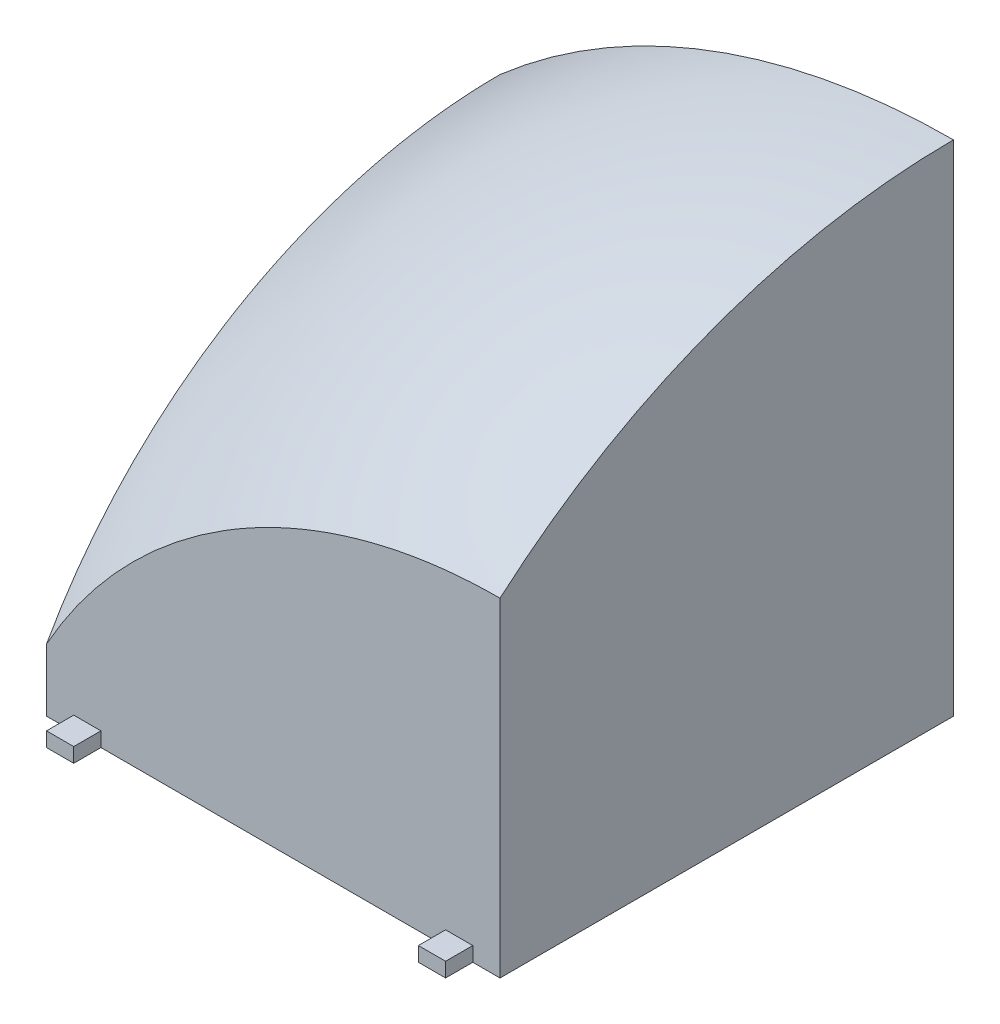
ISO-10303-21;
HEADER;
FILE_DESCRIPTION(('STEP AP214'),'2;1');
FILE_NAME('part.step','',(''),(''),'','','');
FILE_SCHEMA(('AUTOMOTIVE_DESIGN { 1 0 10303 214 1 1 1 1 }'));
ENDSEC;
DATA;
#1=APPLICATION_CONTEXT('core data for automotive mechanical design processes');
#2=APPLICATION_PROTOCOL_DEFINITION('international standard','automotive_design',2000,#1);
#3=PRODUCT_CONTEXT('',#1,'mechanical');
#4=PRODUCT('Part','Part','',(#3));
#5=PRODUCT_RELATED_PRODUCT_CATEGORY('part','',(#4));
#6=PRODUCT_DEFINITION_FORMATION('','',#4);
#7=PRODUCT_DEFINITION_CONTEXT('part definition',#1,'design');
#8=PRODUCT_DEFINITION('design','',#6,#7);
#9=PRODUCT_DEFINITION_SHAPE('','',#8);
#10=(LENGTH_UNIT() NAMED_UNIT(*) SI_UNIT(.MILLI.,.METRE.));
#11=(NAMED_UNIT(*) PLANE_ANGLE_UNIT() SI_UNIT($,.RADIAN.));
#12=(NAMED_UNIT(*) SI_UNIT($,.STERADIAN.) SOLID_ANGLE_UNIT());
#13=UNCERTAINTY_MEASURE_WITH_UNIT(LENGTH_MEASURE(1.E-05),#10,'distance_accuracy_value','');
#14=(GEOMETRIC_REPRESENTATION_CONTEXT(3) GLOBAL_UNCERTAINTY_ASSIGNED_CONTEXT((#13)) GLOBAL_UNIT_ASSIGNED_CONTEXT((#10,
#11,#12)) REPRESENTATION_CONTEXT('',''));
#15=CARTESIAN_POINT('',(0.,0.,0.));
#16=DIRECTION('',(0.,0.,1.));
#17=DIRECTION('',(1.,0.,0.));
#18=AXIS2_PLACEMENT_3D('',#15,#16,#17);
#19=CARTESIAN_POINT('',(-317.5,508.,0.));
#20=DIRECTION('',(1.,0.,0.));
#21=DIRECTION('',(0.,0.,-1.));
#22=AXIS2_PLACEMENT_3D('',#19,#20,#21);
#23=PLANE('',#22);
#24=DIRECTION('',(0.,0.,1.));
#25=VECTOR('',#24,1.);
#26=CARTESIAN_POINT('',(-317.5,143.307853797554,298.45));
#27=LINE('',#26,#25);
#28=CARTESIAN_POINT('',(-317.5,143.307853797554,279.4));
#29=VERTEX_POINT('',#28);
#30=CARTESIAN_POINT('',(-317.5,143.307853797554,298.45));
#31=VERTEX_POINT('',#30);
#32=EDGE_CURVE('E267',#29,#31,#27,.T.);
#33=ORIENTED_EDGE('',*,*,#32,.T.);
#34=DIRECTION('',(0.,-1.,0.));
#35=VECTOR('',#34,1.);
#36=CARTESIAN_POINT('',(-317.5,143.307853797554,298.45));
#37=LINE('',#36,#35);
#38=CARTESIAN_POINT('',(-317.5,133.147853797553,298.45));
#39=VERTEX_POINT('',#38);
#40=EDGE_CURVE('E277',#31,#39,#37,.T.);
#41=ORIENTED_EDGE('',*,*,#40,.T.);
#42=DIRECTION('',(0.,0.,-1.));
#43=VECTOR('',#42,1.);
#44=CARTESIAN_POINT('',(-317.5,133.147853797553,354.313014613424));
#45=LINE('',#44,#43);
#46=CARTESIAN_POINT('',(-317.5,133.147853797553,317.5));
#47=VERTEX_POINT('',#46);
#48=EDGE_CURVE('E408',#47,#39,#45,.T.);
#49=ORIENTED_EDGE('',*,*,#48,.F.);
#50=DIRECTION('',(0.,-1.,0.));
#51=VECTOR('',#50,1.);
#52=CARTESIAN_POINT('',(-317.5,508.,317.5));
#53=LINE('',#52,#51);
#54=CARTESIAN_POINT('',(-317.5,176.890531120238,317.5));
#55=VERTEX_POINT('',#54);
#56=EDGE_CURVE('E421',#55,#47,#53,.T.);
#57=ORIENTED_EDGE('',*,*,#56,.F.);
#58=CARTESIAN_POINT('',(-317.5,0.,0.));
#59=DIRECTION('',(1.,0.,0.));
#60=DIRECTION('',(0.,0.,-1.));
#61=AXIS2_PLACEMENT_3D('',#58,#59,#60);
#62=CIRCLE('',#61,363.450835739856);
#63=CARTESIAN_POINT('',(-317.5,363.450835739856,0.));
#64=VERTEX_POINT('',#63);
#65=EDGE_CURVE('E432',#55,#64,#62,.F.);
#66=ORIENTED_EDGE('',*,*,#65,.T.);
#67=DIRECTION('',(0.,-1.,0.));
#68=VECTOR('',#67,1.);
#69=CARTESIAN_POINT('',(-317.5,508.,0.));
#70=LINE('',#69,#68);
#71=CARTESIAN_POINT('',(-317.5,133.147853797553,0.));
#72=VERTEX_POINT('',#71);
#73=EDGE_CURVE('E424',#64,#72,#70,.T.);
#74=ORIENTED_EDGE('',*,*,#73,.T.);
#75=CARTESIAN_POINT('',(-317.5,133.147853797553,19.0500000000001));
#76=VERTEX_POINT('',#75);
#77=EDGE_CURVE('E403',#76,#72,#45,.T.);
#78=ORIENTED_EDGE('',*,*,#77,.F.);
#79=DIRECTION('',(0.,-1.,0.));
#80=VECTOR('',#79,1.);
#81=CARTESIAN_POINT('',(-317.5,143.307853797554,19.0500000000001));
#82=LINE('',#81,#80);
#83=CARTESIAN_POINT('',(-317.5,143.307853797554,19.0500000000001));
#84=VERTEX_POINT('',#83);
#85=EDGE_CURVE('E299',#84,#76,#82,.T.);
#86=ORIENTED_EDGE('',*,*,#85,.F.);
#87=DIRECTION('',(0.,0.,1.));
#88=VECTOR('',#87,1.);
#89=CARTESIAN_POINT('',(-317.5,143.307853797554,19.0500000000001));
#90=LINE('',#89,#88);
#91=CARTESIAN_POINT('',(-317.5,143.307853797554,38.1000000000001));
#92=VERTEX_POINT('',#91);
#93=EDGE_CURVE('E289',#84,#92,#90,.T.);
#94=ORIENTED_EDGE('',*,*,#93,.T.);
#95=DIRECTION('',(0.,-1.,0.));
#96=VECTOR('',#95,1.);
#97=CARTESIAN_POINT('',(-317.5,143.307853797554,38.1000000000001));
#98=LINE('',#97,#96);
#99=CARTESIAN_POINT('',(-317.5,133.147853797553,38.1000000000001));
#100=VERTEX_POINT('',#99);
#101=EDGE_CURVE('E312',#92,#100,#98,.T.);
#102=ORIENTED_EDGE('',*,*,#101,.T.);
#103=CARTESIAN_POINT('',(-317.5,133.147853797553,279.4));
#104=VERTEX_POINT('',#103);
#105=EDGE_CURVE('E412',#104,#100,#45,.T.);
#106=ORIENTED_EDGE('',*,*,#105,.F.);
#107=DIRECTION('',(0.,-1.,0.));
#108=VECTOR('',#107,1.);
#109=CARTESIAN_POINT('',(-317.5,143.307853797554,279.4));
#110=LINE('',#109,#108);
#111=EDGE_CURVE('E281',#29,#104,#110,.T.);
#112=ORIENTED_EDGE('',*,*,#111,.F.);
#113=EDGE_LOOP('',(#33,#41,#49,#57,#66,#74,#78,#86,#94,#102,#106,#112));
#114=FACE_BOUND('',#113,.T.);
#115=ADVANCED_FACE('F40',(#114),#23,.F.);
#116=CARTESIAN_POINT('',(0.,508.,317.5));
#117=DIRECTION('',(0.,0.,-1.));
#118=DIRECTION('',(-1.,0.,0.));
#119=AXIS2_PLACEMENT_3D('',#116,#117,#118);
#120=PLANE('',#119);
#121=DIRECTION('',(1.,0.,0.));
#122=VECTOR('',#121,1.);
#123=CARTESIAN_POINT('',(-19.0499999999999,143.307853797554,317.5));
#124=LINE('',#123,#122);
#125=CARTESIAN_POINT('',(-38.1,143.307853797554,317.5));
#126=VERTEX_POINT('',#125);
#127=CARTESIAN_POINT('',(-19.0499999999999,143.307853797554,317.5));
#128=VERTEX_POINT('',#127);
#129=EDGE_CURVE('E326',#126,#128,#124,.T.);
#130=ORIENTED_EDGE('',*,*,#129,.T.);
#131=DIRECTION('',(0.,-1.,0.));
#132=VECTOR('',#131,1.);
#133=CARTESIAN_POINT('',(-19.0499999999999,143.307853797554,317.5));
#134=LINE('',#133,#132);
#135=CARTESIAN_POINT('',(-19.0499999999999,133.147853797553,317.5));
#136=VERTEX_POINT('',#135);
#137=EDGE_CURVE('E336',#128,#136,#134,.T.);
#138=ORIENTED_EDGE('',*,*,#137,.T.);
#139=DIRECTION('',(1.,0.,0.));
#140=VECTOR('',#139,1.);
#141=CARTESIAN_POINT('',(0.,133.147853797553,317.5));
#142=LINE('',#141,#140);
#143=CARTESIAN_POINT('',(0.,133.147853797553,317.5));
#144=VERTEX_POINT('',#143);
#145=EDGE_CURVE('E49',#136,#144,#142,.T.);
#146=ORIENTED_EDGE('',*,*,#145,.T.);
#147=DIRECTION('',(0.,-1.,0.));
#148=VECTOR('',#147,1.);
#149=CARTESIAN_POINT('',(0.,508.,317.5));
#150=LINE('',#149,#148);
#151=CARTESIAN_POINT('',(0.,363.450835739856,317.5));
#152=VERTEX_POINT('',#151);
#153=EDGE_CURVE('E418',#152,#144,#150,.T.);
#154=ORIENTED_EDGE('',*,*,#153,.F.);
#155=CARTESIAN_POINT('',(0.,0.,317.5));
#156=DIRECTION('',(0.,0.,-1.));
#157=DIRECTION('',(-1.,0.,0.));
#158=AXIS2_PLACEMENT_3D('',#155,#156,#157);
#159=CIRCLE('',#158,363.450835739856);
#160=EDGE_CURVE('E430',#152,#55,#159,.F.);
#161=ORIENTED_EDGE('',*,*,#160,.T.);
#162=ORIENTED_EDGE('',*,*,#56,.T.);
#163=CARTESIAN_POINT('',(-298.45,133.147853797553,317.5));
#164=VERTEX_POINT('',#163);
#165=EDGE_CURVE('E11',#47,#164,#142,.T.);
#166=ORIENTED_EDGE('',*,*,#165,.T.);
#167=DIRECTION('',(0.,-1.,0.));
#168=VECTOR('',#167,1.);
#169=CARTESIAN_POINT('',(-298.45,143.307853797554,317.5));
#170=LINE('',#169,#168);
#171=CARTESIAN_POINT('',(-298.45,143.307853797554,317.5));
#172=VERTEX_POINT('',#171);
#173=EDGE_CURVE('E359',#172,#164,#170,.T.);
#174=ORIENTED_EDGE('',*,*,#173,.F.);
#175=DIRECTION('',(1.,0.,0.));
#176=VECTOR('',#175,1.);
#177=CARTESIAN_POINT('',(-298.45,143.307853797554,317.5));
#178=LINE('',#177,#176);
#179=CARTESIAN_POINT('',(-279.4,143.307853797554,317.5));
#180=VERTEX_POINT('',#179);
#181=EDGE_CURVE('E349',#172,#180,#178,.T.);
#182=ORIENTED_EDGE('',*,*,#181,.T.);
#183=DIRECTION('',(0.,-1.,0.));
#184=VECTOR('',#183,1.);
#185=CARTESIAN_POINT('',(-279.4,143.307853797554,317.5));
#186=LINE('',#185,#184);
#187=CARTESIAN_POINT('',(-279.4,133.147853797553,317.5));
#188=VERTEX_POINT('',#187);
#189=EDGE_CURVE('E372',#180,#188,#186,.T.);
#190=ORIENTED_EDGE('',*,*,#189,.T.);
#191=CARTESIAN_POINT('',(-38.1,133.147853797553,317.5));
#192=VERTEX_POINT('',#191);
#193=EDGE_CURVE('E48',#188,#192,#142,.T.);
#194=ORIENTED_EDGE('',*,*,#193,.T.);
#195=DIRECTION('',(0.,-1.,0.));
#196=VECTOR('',#195,1.);
#197=CARTESIAN_POINT('',(-38.0999999999999,143.307853797554,317.5));
#198=LINE('',#197,#196);
#199=EDGE_CURVE('E340',#126,#192,#198,.T.);
#200=ORIENTED_EDGE('',*,*,#199,.F.);
#201=EDGE_LOOP('',(#130,#138,#146,#154,#161,#162,#166,#174,#182,#190,#194,#200));
#202=FACE_BOUND('',#201,.T.);
#203=ADVANCED_FACE('F444',(#202),#120,.F.);
#204=CARTESIAN_POINT('',(0.,508.,0.));
#205=DIRECTION('',(-1.,0.,0.));
#206=DIRECTION('',(0.,0.,1.));
#207=AXIS2_PLACEMENT_3D('',#204,#205,#206);
#208=PLANE('',#207);
#209=ORIENTED_EDGE('',*,*,#153,.T.);
#210=DIRECTION('',(0.,0.,-1.));
#211=VECTOR('',#210,1.);
#212=CARTESIAN_POINT('',(0.,133.147853797553,0.));
#213=LINE('',#212,#211);
#214=CARTESIAN_POINT('',(0.,133.147853797553,0.));
#215=VERTEX_POINT('',#214);
#216=EDGE_CURVE('E411',#144,#215,#213,.T.);
#217=ORIENTED_EDGE('',*,*,#216,.T.);
#218=DIRECTION('',(0.,-1.,0.));
#219=VECTOR('',#218,1.);
#220=CARTESIAN_POINT('',(0.,508.,0.));
#221=LINE('',#220,#219);
#222=CARTESIAN_POINT('',(0.,482.6,0.));
#223=VERTEX_POINT('',#222);
#224=EDGE_CURVE('E427',#223,#215,#221,.T.);
#225=ORIENTED_EDGE('',*,*,#224,.F.);
#226=CARTESIAN_POINT('',(0.,0.,0.));
#227=DIRECTION('',(-1.,0.,0.));
#228=DIRECTION('',(0.,0.,1.));
#229=AXIS2_PLACEMENT_3D('',#226,#227,#228);
#230=CIRCLE('',#229,482.6);
#231=EDGE_CURVE('E435',#223,#152,#230,.F.);
#232=ORIENTED_EDGE('',*,*,#231,.T.);
#233=EDGE_LOOP('',(#209,#217,#225,#232));
#234=FACE_BOUND('',#233,.T.);
#235=ADVANCED_FACE('F481',(#234),#208,.F.);
#236=CARTESIAN_POINT('',(0.,508.,0.));
#237=DIRECTION('',(0.,0.,1.));
#238=DIRECTION('',(1.,0.,0.));
#239=AXIS2_PLACEMENT_3D('',#236,#237,#238);
#240=PLANE('',#239);
#241=ORIENTED_EDGE('',*,*,#224,.T.);
#242=DIRECTION('',(-1.,0.,0.));
#243=VECTOR('',#242,1.);
#244=CARTESIAN_POINT('',(0.,133.147853797553,0.));
#245=LINE('',#244,#243);
#246=EDGE_CURVE('E415',#215,#72,#245,.T.);
#247=ORIENTED_EDGE('',*,*,#246,.T.);
#248=ORIENTED_EDGE('',*,*,#73,.F.);
#249=CARTESIAN_POINT('',(0.,0.,0.));
#250=DIRECTION('',(0.,0.,1.));
#251=DIRECTION('',(1.,0.,0.));
#252=AXIS2_PLACEMENT_3D('',#249,#250,#251);
#253=CIRCLE('',#252,482.6);
#254=EDGE_CURVE('E434',#64,#223,#253,.F.);
#255=ORIENTED_EDGE('',*,*,#254,.T.);
#256=EDGE_LOOP('',(#241,#247,#248,#255));
#257=FACE_BOUND('',#256,.T.);
#258=ADVANCED_FACE('F485',(#257),#240,.F.);
#259=CARTESIAN_POINT('',(0.,0.,0.));
#260=DIRECTION('',(0.,1.,0.));
#261=DIRECTION('',(1.,0.,0.));
#262=AXIS2_PLACEMENT_3D('',#259,#260,#261);
#263=SPHERICAL_SURFACE('',#262,482.6);
#264=ORIENTED_EDGE('',*,*,#231,.F.);
#265=ORIENTED_EDGE('',*,*,#254,.F.);
#266=ORIENTED_EDGE('',*,*,#65,.F.);
#267=ORIENTED_EDGE('',*,*,#160,.F.);
#268=EDGE_LOOP('',(#264,#265,#266,#267));
#269=FACE_BOUND('',#268,.T.);
#270=ADVANCED_FACE('F42',(#269),#263,.T.);
#271=CARTESIAN_POINT('',(190.5,133.147853797553,354.313014613424));
#272=DIRECTION('',(0.,1.,0.));
#273=DIRECTION('',(0.,0.,1.));
#274=AXIS2_PLACEMENT_3D('',#271,#272,#273);
#275=PLANE('',#274);
#276=DIRECTION('',(1.,0.,0.));
#277=VECTOR('',#276,1.);
#278=CARTESIAN_POINT('',(0.,133.147853797553,307.34));
#279=LINE('',#278,#277);
#280=CARTESIAN_POINT('',(-307.34,133.147853797553,307.34));
#281=VERTEX_POINT('',#280);
#282=CARTESIAN_POINT('',(-10.16,133.147853797553,307.34));
#283=VERTEX_POINT('',#282);
#284=EDGE_CURVE('E389',#281,#283,#279,.T.);
#285=ORIENTED_EDGE('',*,*,#284,.T.);
#286=DIRECTION('',(0.,0.,-1.));
#287=VECTOR('',#286,1.);
#288=CARTESIAN_POINT('',(-10.16,133.147853797553,0.));
#289=LINE('',#288,#287);
#290=CARTESIAN_POINT('',(-10.16,133.147853797553,10.16));
#291=VERTEX_POINT('',#290);
#292=EDGE_CURVE('E398',#283,#291,#289,.T.);
#293=ORIENTED_EDGE('',*,*,#292,.T.);
#294=DIRECTION('',(-1.,0.,0.));
#295=VECTOR('',#294,1.);
#296=CARTESIAN_POINT('',(0.,133.147853797553,10.16));
#297=LINE('',#296,#295);
#298=CARTESIAN_POINT('',(-31.7499999999999,133.147853797553,10.16));
#299=VERTEX_POINT('',#298);
#300=EDGE_CURVE('E380',#291,#299,#297,.T.);
#301=ORIENTED_EDGE('',*,*,#300,.T.);
#302=DIRECTION('',(0.,0.,1.));
#303=VECTOR('',#302,1.);
#304=CARTESIAN_POINT('',(-31.7499999999999,133.147853797553,10.16));
#305=LINE('',#304,#303);
#306=CARTESIAN_POINT('',(-31.7499999999999,133.147853797553,38.1000000000001));
#307=VERTEX_POINT('',#306);
#308=EDGE_CURVE('E637',#299,#307,#305,.T.);
#309=ORIENTED_EDGE('',*,*,#308,.T.);
#310=DIRECTION('',(-1.,0.,0.));
#311=VECTOR('',#310,1.);
#312=CARTESIAN_POINT('',(-50.7999999999999,133.147853797553,38.1000000000001));
#313=LINE('',#312,#311);
#314=CARTESIAN_POINT('',(-50.7999999999999,133.147853797553,38.1000000000001));
#315=VERTEX_POINT('',#314);
#316=EDGE_CURVE('E246',#307,#315,#313,.T.);
#317=ORIENTED_EDGE('',*,*,#316,.T.);
#318=DIRECTION('',(0.,0.,-1.));
#319=VECTOR('',#318,1.);
#320=CARTESIAN_POINT('',(-50.7999999999999,133.147853797553,10.16));
#321=LINE('',#320,#319);
#322=CARTESIAN_POINT('',(-50.7999999999999,133.147853797553,10.16));
#323=VERTEX_POINT('',#322);
#324=EDGE_CURVE('E56',#315,#323,#321,.T.);
#325=ORIENTED_EDGE('',*,*,#324,.T.);
#326=CARTESIAN_POINT('',(-307.34,133.147853797553,10.16));
#327=VERTEX_POINT('',#326);
#328=EDGE_CURVE('E250',#323,#327,#297,.T.);
#329=ORIENTED_EDGE('',*,*,#328,.T.);
#330=DIRECTION('',(0.,0.,-1.));
#331=VECTOR('',#330,1.);
#332=CARTESIAN_POINT('',(-307.34,133.147853797553,354.313014613424));
#333=LINE('',#332,#331);
#334=EDGE_CURVE('E369',#281,#327,#333,.T.);
#335=ORIENTED_EDGE('',*,*,#334,.F.);
#336=EDGE_LOOP('',(#285,#293,#301,#309,#317,#325,#329,#335));
#337=FACE_BOUND('',#336,.T.);
#338=ORIENTED_EDGE('',*,*,#216,.F.);
#339=ORIENTED_EDGE('',*,*,#145,.F.);
#340=DIRECTION('',(0.,0.,1.));
#341=VECTOR('',#340,1.);
#342=CARTESIAN_POINT('',(-19.0499999999999,133.147853797553,317.5));
#343=LINE('',#342,#341);
#344=CARTESIAN_POINT('',(-19.0499999999999,133.147853797553,336.55));
#345=VERTEX_POINT('',#344);
#346=EDGE_CURVE('E309',#136,#345,#343,.T.);
#347=ORIENTED_EDGE('',*,*,#346,.T.);
#348=DIRECTION('',(-1.,0.,0.));
#349=VECTOR('',#348,1.);
#350=CARTESIAN_POINT('',(-19.0499999999999,133.147853797553,336.55));
#351=LINE('',#350,#349);
#352=CARTESIAN_POINT('',(-38.1,133.147853797553,336.55));
#353=VERTEX_POINT('',#352);
#354=EDGE_CURVE('E331',#345,#353,#351,.T.);
#355=ORIENTED_EDGE('',*,*,#354,.T.);
#356=DIRECTION('',(0.,0.,-1.));
#357=VECTOR('',#356,1.);
#358=CARTESIAN_POINT('',(-38.0999999999999,133.147853797553,317.5));
#359=LINE('',#358,#357);
#360=EDGE_CURVE('E320',#353,#192,#359,.T.);
#361=ORIENTED_EDGE('',*,*,#360,.T.);
#362=ORIENTED_EDGE('',*,*,#193,.F.);
#363=DIRECTION('',(0.,0.,1.));
#364=VECTOR('',#363,1.);
#365=CARTESIAN_POINT('',(-279.4,133.147853797553,317.5));
#366=LINE('',#365,#364);
#367=CARTESIAN_POINT('',(-279.4,133.147853797553,336.55));
#368=VERTEX_POINT('',#367);
#369=EDGE_CURVE('E362',#188,#368,#366,.T.);
#370=ORIENTED_EDGE('',*,*,#369,.T.);
#371=DIRECTION('',(-1.,0.,0.));
#372=VECTOR('',#371,1.);
#373=CARTESIAN_POINT('',(-298.45,133.147853797553,336.55));
#374=LINE('',#373,#372);
#375=CARTESIAN_POINT('',(-298.45,133.147853797553,336.55));
#376=VERTEX_POINT('',#375);
#377=EDGE_CURVE('E350',#368,#376,#374,.T.);
#378=ORIENTED_EDGE('',*,*,#377,.T.);
#379=DIRECTION('',(0.,0.,-1.));
#380=VECTOR('',#379,1.);
#381=CARTESIAN_POINT('',(-298.45,133.147853797553,317.5));
#382=LINE('',#381,#380);
#383=EDGE_CURVE('E339',#376,#164,#382,.T.);
#384=ORIENTED_EDGE('',*,*,#383,.T.);
#385=ORIENTED_EDGE('',*,*,#165,.F.);
#386=ORIENTED_EDGE('',*,*,#48,.T.);
#387=DIRECTION('',(-1.,0.,0.));
#388=VECTOR('',#387,1.);
#389=CARTESIAN_POINT('',(-317.5,133.147853797553,298.45));
#390=LINE('',#389,#388);
#391=CARTESIAN_POINT('',(-336.55,133.147853797553,298.45));
#392=VERTEX_POINT('',#391);
#393=EDGE_CURVE('E271',#39,#392,#390,.T.);
#394=ORIENTED_EDGE('',*,*,#393,.T.);
#395=DIRECTION('',(0.,0.,-1.));
#396=VECTOR('',#395,1.);
#397=CARTESIAN_POINT('',(-336.55,133.147853797553,298.45));
#398=LINE('',#397,#396);
#399=CARTESIAN_POINT('',(-336.55,133.147853797553,279.4));
#400=VERTEX_POINT('',#399);
#401=EDGE_CURVE('E274',#392,#400,#398,.T.);
#402=ORIENTED_EDGE('',*,*,#401,.T.);
#403=DIRECTION('',(1.,0.,0.));
#404=VECTOR('',#403,1.);
#405=CARTESIAN_POINT('',(-317.5,133.147853797553,279.4));
#406=LINE('',#405,#404);
#407=EDGE_CURVE('E64',#400,#104,#406,.T.);
#408=ORIENTED_EDGE('',*,*,#407,.T.);
#409=ORIENTED_EDGE('',*,*,#105,.T.);
#410=DIRECTION('',(-1.,0.,0.));
#411=VECTOR('',#410,1.);
#412=CARTESIAN_POINT('',(-317.5,133.147853797553,38.1000000000001));
#413=LINE('',#412,#411);
#414=CARTESIAN_POINT('',(-336.55,133.147853797553,38.1000000000001));
#415=VERTEX_POINT('',#414);
#416=EDGE_CURVE('E302',#100,#415,#413,.T.);
#417=ORIENTED_EDGE('',*,*,#416,.T.);
#418=DIRECTION('',(0.,0.,-1.));
#419=VECTOR('',#418,1.);
#420=CARTESIAN_POINT('',(-336.55,133.147853797553,19.0500000000001));
#421=LINE('',#420,#419);
#422=CARTESIAN_POINT('',(-336.55,133.147853797553,19.0500000000001));
#423=VERTEX_POINT('',#422);
#424=EDGE_CURVE('E290',#415,#423,#421,.T.);
#425=ORIENTED_EDGE('',*,*,#424,.T.);
#426=DIRECTION('',(1.,0.,0.));
#427=VECTOR('',#426,1.);
#428=CARTESIAN_POINT('',(-317.5,133.147853797553,19.0500000000001));
#429=LINE('',#428,#427);
#430=EDGE_CURVE('E280',#423,#76,#429,.T.);
#431=ORIENTED_EDGE('',*,*,#430,.T.);
#432=ORIENTED_EDGE('',*,*,#77,.T.);
#433=ORIENTED_EDGE('',*,*,#246,.F.);
#434=EDGE_LOOP('',(#338,#339,#347,#355,#361,#362,#370,#378,#384,#385,#386,#394,#402,#408,#409,
#417,#425,#431,#432,#433));
#435=FACE_BOUND('',#434,.T.);
#436=ADVANCED_FACE('F450',(#337,#435),#275,.F.);
#437=CARTESIAN_POINT('',(-10.16,508.,0.));
#438=DIRECTION('',(-1.,0.,0.));
#439=DIRECTION('',(0.,0.,1.));
#440=AXIS2_PLACEMENT_3D('',#437,#438,#439);
#441=PLANE('',#440);
#442=DIRECTION('',(0.,-1.,0.));
#443=VECTOR('',#442,1.);
#444=CARTESIAN_POINT('',(-10.16,508.,307.34));
#445=LINE('',#444,#443);
#446=CARTESIAN_POINT('',(-10.16,358.662030887018,307.34));
#447=VERTEX_POINT('',#446);
#448=EDGE_CURVE('E376',#447,#283,#445,.T.);
#449=ORIENTED_EDGE('',*,*,#448,.F.);
#450=CARTESIAN_POINT('',(-10.16,0.,0.));
#451=DIRECTION('',(-1.,0.,0.));
#452=DIRECTION('',(0.,0.,1.));
#453=AXIS2_PLACEMENT_3D('',#450,#451,#452);
#454=CIRCLE('',#453,472.330740054043);
#455=CARTESIAN_POINT('',(-10.16,472.221454828135,10.16));
#456=VERTEX_POINT('',#455);
#457=EDGE_CURVE('E386',#456,#447,#454,.F.);
#458=ORIENTED_EDGE('',*,*,#457,.F.);
#459=DIRECTION('',(0.,-1.,0.));
#460=VECTOR('',#459,1.);
#461=CARTESIAN_POINT('',(-10.16,508.,10.16));
#462=LINE('',#461,#460);
#463=EDGE_CURVE('E381',#456,#291,#462,.T.);
#464=ORIENTED_EDGE('',*,*,#463,.T.);
#465=ORIENTED_EDGE('',*,*,#292,.F.);
#466=EDGE_LOOP('',(#449,#458,#464,#465));
#467=FACE_BOUND('',#466,.T.);
#468=ADVANCED_FACE('F643',(#467),#441,.T.);
#469=CARTESIAN_POINT('',(0.,508.,10.16));
#470=DIRECTION('',(0.,0.,1.));
#471=DIRECTION('',(1.,0.,0.));
#472=AXIS2_PLACEMENT_3D('',#469,#470,#471);
#473=PLANE('',#472);
#474=DIRECTION('',(0.,-1.,0.));
#475=VECTOR('',#474,1.);
#476=CARTESIAN_POINT('',(-50.7999999999999,143.307853797554,10.16));
#477=LINE('',#476,#475);
#478=CARTESIAN_POINT('',(-50.7999999999999,143.307853797554,10.16));
#479=VERTEX_POINT('',#478);
#480=EDGE_CURVE('E243',#479,#323,#477,.T.);
#481=ORIENTED_EDGE('',*,*,#480,.F.);
#482=DIRECTION('',(1.,0.,0.));
#483=VECTOR('',#482,1.);
#484=CARTESIAN_POINT('',(-50.7999999999999,143.307853797554,10.16));
#485=LINE('',#484,#483);
#486=CARTESIAN_POINT('',(-31.7499999999999,143.307853797554,10.16));
#487=VERTEX_POINT('',#486);
#488=EDGE_CURVE('E229',#479,#487,#485,.T.);
#489=ORIENTED_EDGE('',*,*,#488,.T.);
#490=DIRECTION('',(0.,-1.,0.));
#491=VECTOR('',#490,1.);
#492=CARTESIAN_POINT('',(-31.7499999999999,143.307853797554,10.16));
#493=LINE('',#492,#491);
#494=EDGE_CURVE('E251',#487,#299,#493,.T.);
#495=ORIENTED_EDGE('',*,*,#494,.T.);
#496=ORIENTED_EDGE('',*,*,#300,.F.);
#497=ORIENTED_EDGE('',*,*,#463,.F.);
#498=CARTESIAN_POINT('',(0.,0.,10.16));
#499=DIRECTION('',(0.,0.,1.));
#500=DIRECTION('',(1.,0.,0.));
#501=AXIS2_PLACEMENT_3D('',#498,#499,#500);
#502=CIRCLE('',#501,472.330740054043);
#503=CARTESIAN_POINT('',(-307.34,358.662030887018,10.16));
#504=VERTEX_POINT('',#503);
#505=EDGE_CURVE('E390',#504,#456,#502,.F.);
#506=ORIENTED_EDGE('',*,*,#505,.F.);
#507=DIRECTION('',(0.,-1.,0.));
#508=VECTOR('',#507,1.);
#509=CARTESIAN_POINT('',(-307.34,508.,10.16));
#510=LINE('',#509,#508);
#511=EDGE_CURVE('E385',#504,#327,#510,.T.);
#512=ORIENTED_EDGE('',*,*,#511,.T.);
#513=ORIENTED_EDGE('',*,*,#328,.F.);
#514=EDGE_LOOP('',(#481,#489,#495,#496,#497,#506,#512,#513));
#515=FACE_BOUND('',#514,.T.);
#516=ADVANCED_FACE('F248',(#515),#473,.T.);
#517=CARTESIAN_POINT('',(-307.34,508.,0.));
#518=DIRECTION('',(1.,0.,0.));
#519=DIRECTION('',(0.,0.,-1.));
#520=AXIS2_PLACEMENT_3D('',#517,#518,#519);
#521=PLANE('',#520);
#522=ORIENTED_EDGE('',*,*,#511,.F.);
#523=CARTESIAN_POINT('',(-307.34,0.,0.));
#524=DIRECTION('',(1.,0.,0.));
#525=DIRECTION('',(0.,0.,-1.));
#526=AXIS2_PLACEMENT_3D('',#523,#524,#525);
#527=CIRCLE('',#526,358.805905748498);
#528=CARTESIAN_POINT('',(-307.34,185.158857201053,307.34));
#529=VERTEX_POINT('',#528);
#530=EDGE_CURVE('E393',#529,#504,#527,.F.);
#531=ORIENTED_EDGE('',*,*,#530,.F.);
#532=DIRECTION('',(0.,-1.,0.));
#533=VECTOR('',#532,1.);
#534=CARTESIAN_POINT('',(-307.34,508.,307.34));
#535=LINE('',#534,#533);
#536=EDGE_CURVE('E379',#529,#281,#535,.T.);
#537=ORIENTED_EDGE('',*,*,#536,.T.);
#538=ORIENTED_EDGE('',*,*,#334,.T.);
#539=EDGE_LOOP('',(#522,#531,#537,#538));
#540=FACE_BOUND('',#539,.T.);
#541=ADVANCED_FACE('F655',(#540),#521,.T.);
#542=CARTESIAN_POINT('',(0.,508.,307.34));
#543=DIRECTION('',(0.,0.,-1.));
#544=DIRECTION('',(-1.,0.,0.));
#545=AXIS2_PLACEMENT_3D('',#542,#543,#544);
#546=PLANE('',#545);
#547=ORIENTED_EDGE('',*,*,#536,.F.);
#548=CARTESIAN_POINT('',(0.,0.,307.34));
#549=DIRECTION('',(0.,0.,-1.));
#550=DIRECTION('',(-1.,0.,0.));
#551=AXIS2_PLACEMENT_3D('',#548,#549,#550);
#552=CIRCLE('',#551,358.805905748498);
#553=EDGE_CURVE('E384',#447,#529,#552,.F.);
#554=ORIENTED_EDGE('',*,*,#553,.F.);
#555=ORIENTED_EDGE('',*,*,#448,.T.);
#556=ORIENTED_EDGE('',*,*,#284,.F.);
#557=EDGE_LOOP('',(#547,#554,#555,#556));
#558=FACE_BOUND('',#557,.T.);
#559=ADVANCED_FACE('F648',(#558),#546,.T.);
#560=CARTESIAN_POINT('',(0.,0.,0.));
#561=DIRECTION('',(0.,1.,0.));
#562=DIRECTION('',(1.,0.,0.));
#563=AXIS2_PLACEMENT_3D('',#560,#561,#562);
#564=SPHERICAL_SURFACE('',#563,472.44);
#565=ORIENTED_EDGE('',*,*,#457,.T.);
#566=ORIENTED_EDGE('',*,*,#553,.T.);
#567=ORIENTED_EDGE('',*,*,#530,.T.);
#568=ORIENTED_EDGE('',*,*,#505,.T.);
#569=EDGE_LOOP('',(#565,#566,#567,#568));
#570=FACE_BOUND('',#569,.T.);
#571=ADVANCED_FACE('F651',(#570),#564,.F.);
#572=CARTESIAN_POINT('',(-298.45,143.307853797554,317.5));
#573=DIRECTION('',(-1.,0.,0.));
#574=DIRECTION('',(0.,0.,1.));
#575=AXIS2_PLACEMENT_3D('',#572,#573,#574);
#576=PLANE('',#575);
#577=ORIENTED_EDGE('',*,*,#383,.F.);
#578=DIRECTION('',(0.,-1.,0.));
#579=VECTOR('',#578,1.);
#580=CARTESIAN_POINT('',(-298.45,143.307853797554,336.55));
#581=LINE('',#580,#579);
#582=CARTESIAN_POINT('',(-298.45,143.307853797554,336.55));
#583=VERTEX_POINT('',#582);
#584=EDGE_CURVE('E367',#583,#376,#581,.T.);
#585=ORIENTED_EDGE('',*,*,#584,.F.);
#586=DIRECTION('',(0.,0.,-1.));
#587=VECTOR('',#586,1.);
#588=CARTESIAN_POINT('',(-298.45,143.307853797554,317.5));
#589=LINE('',#588,#587);
#590=EDGE_CURVE('E346',#583,#172,#589,.T.);
#591=ORIENTED_EDGE('',*,*,#590,.T.);
#592=ORIENTED_EDGE('',*,*,#173,.T.);
#593=EDGE_LOOP('',(#577,#585,#591,#592));
#594=FACE_BOUND('',#593,.T.);
#595=ADVANCED_FACE('F668',(#594),#576,.T.);
#596=CARTESIAN_POINT('',(-298.45,143.307853797554,336.55));
#597=DIRECTION('',(0.,0.,1.));
#598=DIRECTION('',(1.,0.,0.));
#599=AXIS2_PLACEMENT_3D('',#596,#597,#598);
#600=PLANE('',#599);
#601=ORIENTED_EDGE('',*,*,#377,.F.);
#602=DIRECTION('',(0.,-1.,0.));
#603=VECTOR('',#602,1.);
#604=CARTESIAN_POINT('',(-279.4,143.307853797554,336.55));
#605=LINE('',#604,#603);
#606=CARTESIAN_POINT('',(-279.4,143.307853797554,336.55));
#607=VERTEX_POINT('',#606);
#608=EDGE_CURVE('E370',#607,#368,#605,.T.);
#609=ORIENTED_EDGE('',*,*,#608,.F.);
#610=DIRECTION('',(-1.,0.,0.));
#611=VECTOR('',#610,1.);
#612=CARTESIAN_POINT('',(-298.45,143.307853797554,336.55));
#613=LINE('',#612,#611);
#614=EDGE_CURVE('E356',#607,#583,#613,.T.);
#615=ORIENTED_EDGE('',*,*,#614,.T.);
#616=ORIENTED_EDGE('',*,*,#584,.T.);
#617=EDGE_LOOP('',(#601,#609,#615,#616));
#618=FACE_BOUND('',#617,.T.);
#619=ADVANCED_FACE('F699',(#618),#600,.T.);
#620=CARTESIAN_POINT('',(-279.4,143.307853797554,317.5));
#621=DIRECTION('',(1.,0.,0.));
#622=DIRECTION('',(0.,0.,-1.));
#623=AXIS2_PLACEMENT_3D('',#620,#621,#622);
#624=PLANE('',#623);
#625=ORIENTED_EDGE('',*,*,#369,.F.);
#626=ORIENTED_EDGE('',*,*,#189,.F.);
#627=DIRECTION('',(0.,0.,1.));
#628=VECTOR('',#627,1.);
#629=CARTESIAN_POINT('',(-279.4,143.307853797554,317.5));
#630=LINE('',#629,#628);
#631=EDGE_CURVE('E353',#180,#607,#630,.T.);
#632=ORIENTED_EDGE('',*,*,#631,.T.);
#633=ORIENTED_EDGE('',*,*,#608,.T.);
#634=EDGE_LOOP('',(#625,#626,#632,#633));
#635=FACE_BOUND('',#634,.T.);
#636=ADVANCED_FACE('F470',(#635),#624,.T.);
#637=CARTESIAN_POINT('',(0.,143.307853797554,0.));
#638=DIRECTION('',(0.,1.,0.));
#639=DIRECTION('',(0.,0.,1.));
#640=AXIS2_PLACEMENT_3D('',#637,#638,#639);
#641=PLANE('',#640);
#642=ORIENTED_EDGE('',*,*,#590,.F.);
#643=ORIENTED_EDGE('',*,*,#614,.F.);
#644=ORIENTED_EDGE('',*,*,#631,.F.);
#645=ORIENTED_EDGE('',*,*,#181,.F.);
#646=EDGE_LOOP('',(#642,#643,#644,#645));
#647=FACE_BOUND('',#646,.T.);
#648=ADVANCED_FACE('F463',(#647),#641,.T.);
#649=CARTESIAN_POINT('',(-19.0499999999999,143.307853797554,317.5));
#650=DIRECTION('',(1.,0.,0.));
#651=DIRECTION('',(0.,0.,-1.));
#652=AXIS2_PLACEMENT_3D('',#649,#650,#651);
#653=PLANE('',#652);
#654=ORIENTED_EDGE('',*,*,#346,.F.);
#655=ORIENTED_EDGE('',*,*,#137,.F.);
#656=DIRECTION('',(0.,0.,1.));
#657=VECTOR('',#656,1.);
#658=CARTESIAN_POINT('',(-19.0499999999999,143.307853797554,317.5));
#659=LINE('',#658,#657);
#660=CARTESIAN_POINT('',(-19.0499999999999,143.307853797554,336.55));
#661=VERTEX_POINT('',#660);
#662=EDGE_CURVE('E316',#128,#661,#659,.T.);
#663=ORIENTED_EDGE('',*,*,#662,.T.);
#664=DIRECTION('',(0.,-1.,0.));
#665=VECTOR('',#664,1.);
#666=CARTESIAN_POINT('',(-19.0499999999999,143.307853797554,336.55));
#667=LINE('',#666,#665);
#668=EDGE_CURVE('E328',#661,#345,#667,.T.);
#669=ORIENTED_EDGE('',*,*,#668,.T.);
#670=EDGE_LOOP('',(#654,#655,#663,#669));
#671=FACE_BOUND('',#670,.T.);
#672=ADVANCED_FACE('F461',(#671),#653,.T.);
#673=CARTESIAN_POINT('',(-38.0999999999999,143.307853797554,317.5));
#674=DIRECTION('',(-1.,0.,0.));
#675=DIRECTION('',(0.,0.,1.));
#676=AXIS2_PLACEMENT_3D('',#673,#674,#675);
#677=PLANE('',#676);
#678=ORIENTED_EDGE('',*,*,#360,.F.);
#679=DIRECTION('',(0.,-1.,0.));
#680=VECTOR('',#679,1.);
#681=CARTESIAN_POINT('',(-38.1,143.307853797554,336.55));
#682=LINE('',#681,#680);
#683=CARTESIAN_POINT('',(-38.1,143.307853797554,336.55));
#684=VERTEX_POINT('',#683);
#685=EDGE_CURVE('E343',#684,#353,#682,.T.);
#686=ORIENTED_EDGE('',*,*,#685,.F.);
#687=DIRECTION('',(0.,0.,-1.));
#688=VECTOR('',#687,1.);
#689=CARTESIAN_POINT('',(-38.0999999999999,143.307853797554,317.5));
#690=LINE('',#689,#688);
#691=EDGE_CURVE('E323',#684,#126,#690,.T.);
#692=ORIENTED_EDGE('',*,*,#691,.T.);
#693=ORIENTED_EDGE('',*,*,#199,.T.);
#694=EDGE_LOOP('',(#678,#686,#692,#693));
#695=FACE_BOUND('',#694,.T.);
#696=ADVANCED_FACE('F447',(#695),#677,.T.);
#697=CARTESIAN_POINT('',(-19.0499999999999,143.307853797554,336.55));
#698=DIRECTION('',(0.,0.,1.));
#699=DIRECTION('',(1.,0.,0.));
#700=AXIS2_PLACEMENT_3D('',#697,#698,#699);
#701=PLANE('',#700);
#702=ORIENTED_EDGE('',*,*,#354,.F.);
#703=ORIENTED_EDGE('',*,*,#668,.F.);
#704=DIRECTION('',(-1.,0.,0.));
#705=VECTOR('',#704,1.);
#706=CARTESIAN_POINT('',(-19.0499999999999,143.307853797554,336.55));
#707=LINE('',#706,#705);
#708=EDGE_CURVE('E319',#661,#684,#707,.T.);
#709=ORIENTED_EDGE('',*,*,#708,.T.);
#710=ORIENTED_EDGE('',*,*,#685,.T.);
#711=EDGE_LOOP('',(#702,#703,#709,#710));
#712=FACE_BOUND('',#711,.T.);
#713=ADVANCED_FACE('F454',(#712),#701,.T.);
#714=CARTESIAN_POINT('',(0.,143.307853797554,0.));
#715=DIRECTION('',(0.,-1.,0.));
#716=DIRECTION('',(0.,0.,-1.));
#717=AXIS2_PLACEMENT_3D('',#714,#715,#716);
#718=PLANE('',#717);
#719=ORIENTED_EDGE('',*,*,#662,.F.);
#720=ORIENTED_EDGE('',*,*,#129,.F.);
#721=ORIENTED_EDGE('',*,*,#691,.F.);
#722=ORIENTED_EDGE('',*,*,#708,.F.);
#723=EDGE_LOOP('',(#719,#720,#721,#722));
#724=FACE_BOUND('',#723,.T.);
#725=ADVANCED_FACE('F458',(#724),#718,.F.);
#726=CARTESIAN_POINT('',(-317.5,143.307853797554,19.0500000000001));
#727=DIRECTION('',(0.,0.,-1.));
#728=DIRECTION('',(-1.,0.,0.));
#729=AXIS2_PLACEMENT_3D('',#726,#727,#728);
#730=PLANE('',#729);
#731=ORIENTED_EDGE('',*,*,#430,.F.);
#732=DIRECTION('',(0.,-1.,0.));
#733=VECTOR('',#732,1.);
#734=CARTESIAN_POINT('',(-336.55,143.307853797554,19.0500000000001));
#735=LINE('',#734,#733);
#736=CARTESIAN_POINT('',(-336.55,143.307853797554,19.0500000000001));
#737=VERTEX_POINT('',#736);
#738=EDGE_CURVE('E307',#737,#423,#735,.T.);
#739=ORIENTED_EDGE('',*,*,#738,.F.);
#740=DIRECTION('',(1.,0.,0.));
#741=VECTOR('',#740,1.);
#742=CARTESIAN_POINT('',(-317.5,143.307853797554,19.0500000000001));
#743=LINE('',#742,#741);
#744=EDGE_CURVE('E286',#737,#84,#743,.T.);
#745=ORIENTED_EDGE('',*,*,#744,.T.);
#746=ORIENTED_EDGE('',*,*,#85,.T.);
#747=EDGE_LOOP('',(#731,#739,#745,#746));
#748=FACE_BOUND('',#747,.T.);
#749=ADVANCED_FACE('F512',(#748),#730,.T.);
#750=CARTESIAN_POINT('',(-336.55,143.307853797554,19.0500000000001));
#751=DIRECTION('',(-1.,0.,0.));
#752=DIRECTION('',(0.,0.,1.));
#753=AXIS2_PLACEMENT_3D('',#750,#751,#752);
#754=PLANE('',#753);
#755=ORIENTED_EDGE('',*,*,#424,.F.);
#756=DIRECTION('',(0.,-1.,0.));
#757=VECTOR('',#756,1.);
#758=CARTESIAN_POINT('',(-336.55,143.307853797554,38.1000000000001));
#759=LINE('',#758,#757);
#760=CARTESIAN_POINT('',(-336.55,143.307853797554,38.1000000000001));
#761=VERTEX_POINT('',#760);
#762=EDGE_CURVE('E310',#761,#415,#759,.T.);
#763=ORIENTED_EDGE('',*,*,#762,.F.);
#764=DIRECTION('',(0.,0.,-1.));
#765=VECTOR('',#764,1.);
#766=CARTESIAN_POINT('',(-336.55,143.307853797554,19.0500000000001));
#767=LINE('',#766,#765);
#768=EDGE_CURVE('E296',#761,#737,#767,.T.);
#769=ORIENTED_EDGE('',*,*,#768,.T.);
#770=ORIENTED_EDGE('',*,*,#738,.T.);
#771=EDGE_LOOP('',(#755,#763,#769,#770));
#772=FACE_BOUND('',#771,.T.);
#773=ADVANCED_FACE('F514',(#772),#754,.T.);
#774=CARTESIAN_POINT('',(-317.5,143.307853797554,38.1000000000001));
#775=DIRECTION('',(0.,0.,1.));
#776=DIRECTION('',(1.,0.,0.));
#777=AXIS2_PLACEMENT_3D('',#774,#775,#776);
#778=PLANE('',#777);
#779=ORIENTED_EDGE('',*,*,#416,.F.);
#780=ORIENTED_EDGE('',*,*,#101,.F.);
#781=DIRECTION('',(-1.,0.,0.));
#782=VECTOR('',#781,1.);
#783=CARTESIAN_POINT('',(-317.5,143.307853797554,38.1000000000001));
#784=LINE('',#783,#782);
#785=EDGE_CURVE('E293',#92,#761,#784,.T.);
#786=ORIENTED_EDGE('',*,*,#785,.T.);
#787=ORIENTED_EDGE('',*,*,#762,.T.);
#788=EDGE_LOOP('',(#779,#780,#786,#787));
#789=FACE_BOUND('',#788,.T.);
#790=ADVANCED_FACE('F504',(#789),#778,.T.);
#791=CARTESIAN_POINT('',(0.,143.307853797554,0.));
#792=DIRECTION('',(0.,1.,0.));
#793=DIRECTION('',(0.,0.,1.));
#794=AXIS2_PLACEMENT_3D('',#791,#792,#793);
#795=PLANE('',#794);
#796=ORIENTED_EDGE('',*,*,#744,.F.);
#797=ORIENTED_EDGE('',*,*,#768,.F.);
#798=ORIENTED_EDGE('',*,*,#785,.F.);
#799=ORIENTED_EDGE('',*,*,#93,.F.);
#800=EDGE_LOOP('',(#796,#797,#798,#799));
#801=FACE_BOUND('',#800,.T.);
#802=ADVANCED_FACE('F508',(#801),#795,.T.);
#803=CARTESIAN_POINT('',(-317.5,143.307853797554,298.45));
#804=DIRECTION('',(0.,0.,1.));
#805=DIRECTION('',(1.,0.,0.));
#806=AXIS2_PLACEMENT_3D('',#803,#804,#805);
#807=PLANE('',#806);
#808=ORIENTED_EDGE('',*,*,#393,.F.);
#809=ORIENTED_EDGE('',*,*,#40,.F.);
#810=DIRECTION('',(-1.,0.,0.));
#811=VECTOR('',#810,1.);
#812=CARTESIAN_POINT('',(-317.5,143.307853797554,298.45));
#813=LINE('',#812,#811);
#814=CARTESIAN_POINT('',(-336.55,143.307853797554,298.45));
#815=VERTEX_POINT('',#814);
#816=EDGE_CURVE('E259',#31,#815,#813,.T.);
#817=ORIENTED_EDGE('',*,*,#816,.T.);
#818=DIRECTION('',(0.,-1.,0.));
#819=VECTOR('',#818,1.);
#820=CARTESIAN_POINT('',(-336.55,143.307853797554,298.45));
#821=LINE('',#820,#819);
#822=EDGE_CURVE('E270',#815,#392,#821,.T.);
#823=ORIENTED_EDGE('',*,*,#822,.T.);
#824=EDGE_LOOP('',(#808,#809,#817,#823));
#825=FACE_BOUND('',#824,.T.);
#826=ADVANCED_FACE('F559',(#825),#807,.T.);
#827=CARTESIAN_POINT('',(-317.5,143.307853797554,279.4));
#828=DIRECTION('',(0.,0.,-1.));
#829=DIRECTION('',(-1.,0.,0.));
#830=AXIS2_PLACEMENT_3D('',#827,#828,#829);
#831=PLANE('',#830);
#832=ORIENTED_EDGE('',*,*,#407,.F.);
#833=DIRECTION('',(0.,-1.,0.));
#834=VECTOR('',#833,1.);
#835=CARTESIAN_POINT('',(-336.55,143.307853797554,279.4));
#836=LINE('',#835,#834);
#837=CARTESIAN_POINT('',(-336.55,143.307853797554,279.4));
#838=VERTEX_POINT('',#837);
#839=EDGE_CURVE('E283',#838,#400,#836,.T.);
#840=ORIENTED_EDGE('',*,*,#839,.F.);
#841=DIRECTION('',(1.,0.,0.));
#842=VECTOR('',#841,1.);
#843=CARTESIAN_POINT('',(-317.5,143.307853797554,279.4));
#844=LINE('',#843,#842);
#845=EDGE_CURVE('E265',#838,#29,#844,.T.);
#846=ORIENTED_EDGE('',*,*,#845,.T.);
#847=ORIENTED_EDGE('',*,*,#111,.T.);
#848=EDGE_LOOP('',(#832,#840,#846,#847));
#849=FACE_BOUND('',#848,.T.);
#850=ADVANCED_FACE('F567',(#849),#831,.T.);
#851=CARTESIAN_POINT('',(-336.55,143.307853797554,298.45));
#852=DIRECTION('',(-1.,0.,0.));
#853=DIRECTION('',(0.,0.,1.));
#854=AXIS2_PLACEMENT_3D('',#851,#852,#853);
#855=PLANE('',#854);
#856=ORIENTED_EDGE('',*,*,#401,.F.);
#857=ORIENTED_EDGE('',*,*,#822,.F.);
#858=DIRECTION('',(0.,0.,-1.));
#859=VECTOR('',#858,1.);
#860=CARTESIAN_POINT('',(-336.55,143.307853797554,298.45));
#861=LINE('',#860,#859);
#862=EDGE_CURVE('E262',#815,#838,#861,.T.);
#863=ORIENTED_EDGE('',*,*,#862,.T.);
#864=ORIENTED_EDGE('',*,*,#839,.T.);
#865=EDGE_LOOP('',(#856,#857,#863,#864));
#866=FACE_BOUND('',#865,.T.);
#867=ADVANCED_FACE('F576',(#866),#855,.T.);
#868=CARTESIAN_POINT('',(0.,143.307853797554,0.));
#869=DIRECTION('',(0.,-1.,0.));
#870=DIRECTION('',(0.,0.,-1.));
#871=AXIS2_PLACEMENT_3D('',#868,#869,#870);
#872=PLANE('',#871);
#873=ORIENTED_EDGE('',*,*,#816,.F.);
#874=ORIENTED_EDGE('',*,*,#32,.F.);
#875=ORIENTED_EDGE('',*,*,#845,.F.);
#876=ORIENTED_EDGE('',*,*,#862,.F.);
#877=EDGE_LOOP('',(#873,#874,#875,#876));
#878=FACE_BOUND('',#877,.T.);
#879=ADVANCED_FACE('F586',(#878),#872,.F.);
#880=CARTESIAN_POINT('',(-50.7999999999999,143.307853797554,10.16));
#881=DIRECTION('',(-1.,0.,0.));
#882=DIRECTION('',(0.,0.,1.));
#883=AXIS2_PLACEMENT_3D('',#880,#881,#882);
#884=PLANE('',#883);
#885=ORIENTED_EDGE('',*,*,#324,.F.);
#886=DIRECTION('',(0.,-1.,0.));
#887=VECTOR('',#886,1.);
#888=CARTESIAN_POINT('',(-50.7999999999999,143.307853797554,38.1000000000001));
#889=LINE('',#888,#887);
#890=CARTESIAN_POINT('',(-50.7999999999999,143.307853797554,38.1000000000001));
#891=VERTEX_POINT('',#890);
#892=EDGE_CURVE('E245',#891,#315,#889,.T.);
#893=ORIENTED_EDGE('',*,*,#892,.F.);
#894=DIRECTION('',(0.,0.,-1.));
#895=VECTOR('',#894,1.);
#896=CARTESIAN_POINT('',(-50.7999999999999,143.307853797554,10.16));
#897=LINE('',#896,#895);
#898=EDGE_CURVE('E233',#891,#479,#897,.T.);
#899=ORIENTED_EDGE('',*,*,#898,.T.);
#900=ORIENTED_EDGE('',*,*,#480,.T.);
#901=EDGE_LOOP('',(#885,#893,#899,#900));
#902=FACE_BOUND('',#901,.T.);
#903=ADVANCED_FACE('F242',(#902),#884,.T.);
#904=CARTESIAN_POINT('',(-50.7999999999999,143.307853797554,38.1000000000001));
#905=DIRECTION('',(0.,0.,1.));
#906=DIRECTION('',(1.,0.,0.));
#907=AXIS2_PLACEMENT_3D('',#904,#905,#906);
#908=PLANE('',#907);
#909=ORIENTED_EDGE('',*,*,#316,.F.);
#910=DIRECTION('',(0.,-1.,0.));
#911=VECTOR('',#910,1.);
#912=CARTESIAN_POINT('',(-31.7499999999999,143.307853797554,38.1000000000001));
#913=LINE('',#912,#911);
#914=CARTESIAN_POINT('',(-31.7499999999999,143.307853797554,38.1000000000001));
#915=VERTEX_POINT('',#914);
#916=EDGE_CURVE('E254',#915,#307,#913,.T.);
#917=ORIENTED_EDGE('',*,*,#916,.F.);
#918=DIRECTION('',(-1.,0.,0.));
#919=VECTOR('',#918,1.);
#920=CARTESIAN_POINT('',(-50.7999999999999,143.307853797554,38.1000000000001));
#921=LINE('',#920,#919);
#922=EDGE_CURVE('E252',#915,#891,#921,.T.);
#923=ORIENTED_EDGE('',*,*,#922,.T.);
#924=ORIENTED_EDGE('',*,*,#892,.T.);
#925=EDGE_LOOP('',(#909,#917,#923,#924));
#926=FACE_BOUND('',#925,.T.);
#927=ADVANCED_FACE('F605',(#926),#908,.T.);
#928=CARTESIAN_POINT('',(-31.7499999999999,143.307853797554,10.16));
#929=DIRECTION('',(1.,0.,0.));
#930=DIRECTION('',(0.,0.,-1.));
#931=AXIS2_PLACEMENT_3D('',#928,#929,#930);
#932=PLANE('',#931);
#933=ORIENTED_EDGE('',*,*,#308,.F.);
#934=ORIENTED_EDGE('',*,*,#494,.F.);
#935=DIRECTION('',(0.,0.,1.));
#936=VECTOR('',#935,1.);
#937=CARTESIAN_POINT('',(-31.7499999999999,143.307853797554,10.16));
#938=LINE('',#937,#936);
#939=EDGE_CURVE('E236',#487,#915,#938,.T.);
#940=ORIENTED_EDGE('',*,*,#939,.T.);
#941=ORIENTED_EDGE('',*,*,#916,.T.);
#942=EDGE_LOOP('',(#933,#934,#940,#941));
#943=FACE_BOUND('',#942,.T.);
#944=ADVANCED_FACE('F614',(#943),#932,.T.);
#945=CARTESIAN_POINT('',(0.,143.307853797554,0.));
#946=DIRECTION('',(0.,1.,0.));
#947=DIRECTION('',(0.,0.,1.));
#948=AXIS2_PLACEMENT_3D('',#945,#946,#947);
#949=PLANE('',#948);
#950=ORIENTED_EDGE('',*,*,#898,.F.);
#951=ORIENTED_EDGE('',*,*,#922,.F.);
#952=ORIENTED_EDGE('',*,*,#939,.F.);
#953=ORIENTED_EDGE('',*,*,#488,.F.);
#954=EDGE_LOOP('',(#950,#951,#952,#953));
#955=FACE_BOUND('',#954,.T.);
#956=ADVANCED_FACE('F231',(#955),#949,.T.);
#957=CLOSED_SHELL('',(#115,#203,#235,#258,#270,#436,#468,#516,#541,#559,#571,#595,#619,#636,
#648,#672,#696,#713,#725,#749,#773,#790,#802,#826,#850,#867,#879,#903,#927,#944,#956));
#958=MANIFOLD_SOLID_BREP('B2',#957);
#959=ADVANCED_BREP_SHAPE_REPRESENTATION('',(#18,#958),#14);
#960=SHAPE_DEFINITION_REPRESENTATION(#9,#959);
ENDSEC;
END-ISO-10303-21;
